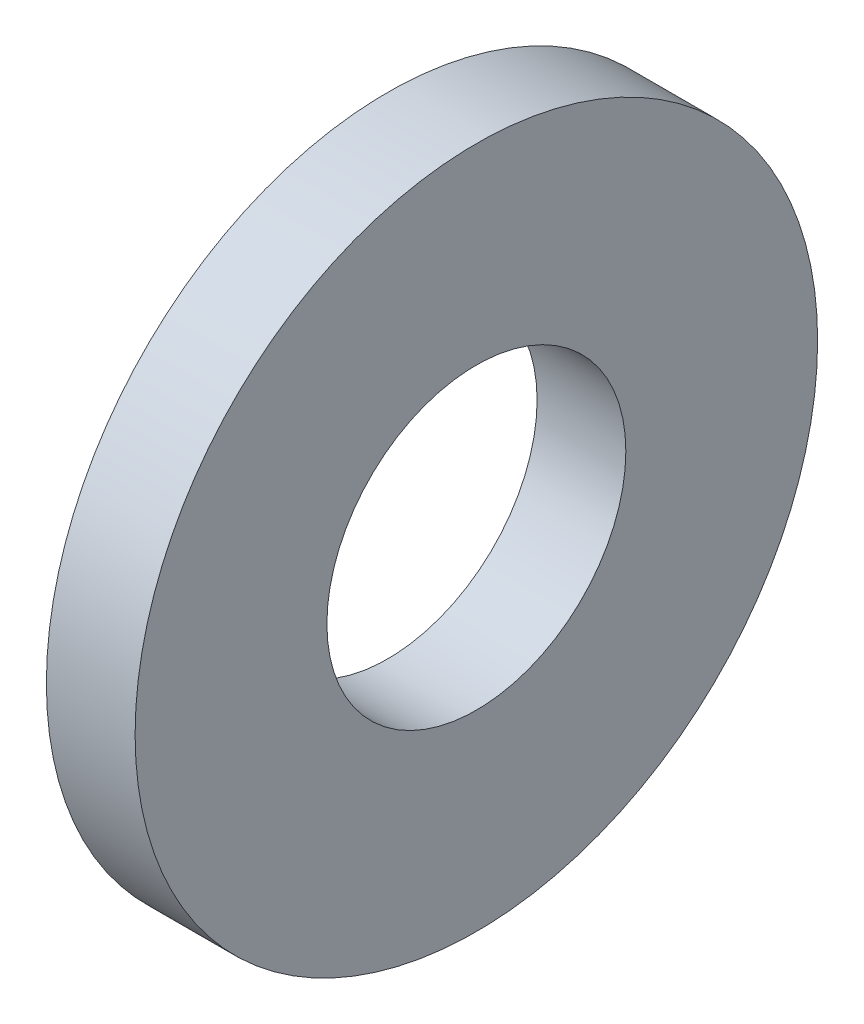
ISO-10303-21;
HEADER;
FILE_DESCRIPTION(('STEP AP214'),'2;1');
FILE_NAME('part.step','',(''),(''),'','','');
FILE_SCHEMA(('AUTOMOTIVE_DESIGN { 1 0 10303 214 1 1 1 1 }'));
ENDSEC;
DATA;
#1=APPLICATION_CONTEXT('core data for automotive mechanical design processes');
#2=APPLICATION_PROTOCOL_DEFINITION('international standard','automotive_design',2000,#1);
#3=PRODUCT_CONTEXT('',#1,'mechanical');
#4=PRODUCT('Part','Part','',(#3));
#5=PRODUCT_RELATED_PRODUCT_CATEGORY('part','',(#4));
#6=PRODUCT_DEFINITION_FORMATION('','',#4);
#7=PRODUCT_DEFINITION_CONTEXT('part definition',#1,'design');
#8=PRODUCT_DEFINITION('design','',#6,#7);
#9=PRODUCT_DEFINITION_SHAPE('','',#8);
#10=(LENGTH_UNIT() NAMED_UNIT(*) SI_UNIT(.MILLI.,.METRE.));
#11=(NAMED_UNIT(*) PLANE_ANGLE_UNIT() SI_UNIT($,.RADIAN.));
#12=(NAMED_UNIT(*) SI_UNIT($,.STERADIAN.) SOLID_ANGLE_UNIT());
#13=UNCERTAINTY_MEASURE_WITH_UNIT(LENGTH_MEASURE(1.E-05),#10,'distance_accuracy_value','');
#14=(GEOMETRIC_REPRESENTATION_CONTEXT(3) GLOBAL_UNCERTAINTY_ASSIGNED_CONTEXT((#13)) GLOBAL_UNIT_ASSIGNED_CONTEXT((#10,
#11,#12)) REPRESENTATION_CONTEXT('',''));
#15=CARTESIAN_POINT('',(0.,0.,0.));
#16=DIRECTION('',(0.,0.,1.));
#17=DIRECTION('',(1.,0.,0.));
#18=AXIS2_PLACEMENT_3D('',#15,#16,#17);
#19=CARTESIAN_POINT('',(1.651,0.,0.));
#20=DIRECTION('',(1.,0.,0.));
#21=DIRECTION('',(0.,0.,-1.));
#22=AXIS2_PLACEMENT_3D('',#19,#20,#21);
#23=PLANE('',#22);
#24=CARTESIAN_POINT('',(1.651,0.,0.));
#25=DIRECTION('',(1.,0.,0.));
#26=DIRECTION('',(0.,0.,-1.));
#27=AXIS2_PLACEMENT_3D('',#24,#25,#26);
#28=CIRCLE('',#27,6.35);
#29=CARTESIAN_POINT('',(1.651,0.,6.35));
#30=VERTEX_POINT('',#29);
#31=EDGE_CURVE('E10',#30,#30,#28,.T.);
#32=ORIENTED_EDGE('',*,*,#31,.T.);
#33=EDGE_LOOP('',(#32));
#34=FACE_BOUND('',#33,.T.);
#35=CARTESIAN_POINT('',(1.651,0.,0.));
#36=DIRECTION('',(1.,0.,0.));
#37=DIRECTION('',(0.,0.,-1.));
#38=AXIS2_PLACEMENT_3D('',#35,#36,#37);
#39=CIRCLE('',#38,2.7813);
#40=CARTESIAN_POINT('',(1.651,0.,2.7813));
#41=VERTEX_POINT('',#40);
#42=EDGE_CURVE('E41',#41,#41,#39,.T.);
#43=ORIENTED_EDGE('',*,*,#42,.F.);
#44=EDGE_LOOP('',(#43));
#45=FACE_BOUND('',#44,.T.);
#46=ADVANCED_FACE('F30',(#34,#45),#23,.T.);
#47=CARTESIAN_POINT('',(0.,0.,0.));
#48=DIRECTION('',(1.,0.,0.));
#49=DIRECTION('',(0.,0.,-1.));
#50=AXIS2_PLACEMENT_3D('',#47,#48,#49);
#51=PLANE('',#50);
#52=CARTESIAN_POINT('',(0.,0.,0.));
#53=DIRECTION('',(1.,0.,0.));
#54=DIRECTION('',(0.,0.,-1.));
#55=AXIS2_PLACEMENT_3D('',#52,#53,#54);
#56=CIRCLE('',#55,6.35);
#57=CARTESIAN_POINT('',(0.,0.,6.35));
#58=VERTEX_POINT('',#57);
#59=EDGE_CURVE('E34',#58,#58,#56,.T.);
#60=ORIENTED_EDGE('',*,*,#59,.F.);
#61=EDGE_LOOP('',(#60));
#62=FACE_BOUND('',#61,.T.);
#63=CARTESIAN_POINT('',(0.,0.,0.));
#64=DIRECTION('',(1.,0.,0.));
#65=DIRECTION('',(0.,0.,-1.));
#66=AXIS2_PLACEMENT_3D('',#63,#64,#65);
#67=CIRCLE('',#66,2.7813);
#68=CARTESIAN_POINT('',(0.,0.,2.7813));
#69=VERTEX_POINT('',#68);
#70=EDGE_CURVE('E43',#69,#69,#67,.T.);
#71=ORIENTED_EDGE('',*,*,#70,.T.);
#72=EDGE_LOOP('',(#71));
#73=FACE_BOUND('',#72,.T.);
#74=ADVANCED_FACE('F53',(#62,#73),#51,.F.);
#75=CARTESIAN_POINT('',(1.651,0.,0.));
#76=DIRECTION('',(-1.,0.,0.));
#77=DIRECTION('',(0.,0.,1.));
#78=AXIS2_PLACEMENT_3D('',#75,#76,#77);
#79=CYLINDRICAL_SURFACE('',#78,6.35);
#80=CARTESIAN_POINT('',(1.651,0.,6.35));
#81=CARTESIAN_POINT('',(1.63380208333333,0.,6.35));
#82=CARTESIAN_POINT('',(1.61660416666667,0.,6.35));
#83=CARTESIAN_POINT('',(1.58220833333333,0.,6.35));
#84=CARTESIAN_POINT('',(1.56501041666667,0.,6.35));
#85=CARTESIAN_POINT('',(1.53061458333333,0.,6.35));
#86=CARTESIAN_POINT('',(1.51341666666667,0.,6.35));
#87=CARTESIAN_POINT('',(1.47902083333333,0.,6.35));
#88=CARTESIAN_POINT('',(1.46182291666667,0.,6.35));
#89=CARTESIAN_POINT('',(1.42742708333333,0.,6.35));
#90=CARTESIAN_POINT('',(1.41022916666667,0.,6.35));
#91=CARTESIAN_POINT('',(1.37583333333333,0.,6.35));
#92=CARTESIAN_POINT('',(1.35863541666667,0.,6.35));
#93=CARTESIAN_POINT('',(1.32423958333333,0.,6.35));
#94=CARTESIAN_POINT('',(1.30704166666667,0.,6.35));
#95=CARTESIAN_POINT('',(1.27264583333333,0.,6.35));
#96=CARTESIAN_POINT('',(1.25544791666667,0.,6.35));
#97=CARTESIAN_POINT('',(1.22105208333333,0.,6.35));
#98=CARTESIAN_POINT('',(1.20385416666667,0.,6.35));
#99=CARTESIAN_POINT('',(1.16945833333333,0.,6.35));
#100=CARTESIAN_POINT('',(1.15226041666667,0.,6.35));
#101=CARTESIAN_POINT('',(1.11786458333333,0.,6.35));
#102=CARTESIAN_POINT('',(1.10066666666667,0.,6.35));
#103=CARTESIAN_POINT('',(1.06627083333333,0.,6.35));
#104=CARTESIAN_POINT('',(1.04907291666667,0.,6.35));
#105=CARTESIAN_POINT('',(1.01467708333333,0.,6.35));
#106=CARTESIAN_POINT('',(0.997479166666666,0.,6.35));
#107=CARTESIAN_POINT('',(0.963083333333333,0.,6.35));
#108=CARTESIAN_POINT('',(0.945885416666667,0.,6.35));
#109=CARTESIAN_POINT('',(0.911489583333333,0.,6.35));
#110=CARTESIAN_POINT('',(0.894291666666667,0.,6.35));
#111=CARTESIAN_POINT('',(0.859895833333333,0.,6.35));
#112=CARTESIAN_POINT('',(0.842697916666667,0.,6.35));
#113=CARTESIAN_POINT('',(0.808302083333333,0.,6.35));
#114=CARTESIAN_POINT('',(0.791104166666667,0.,6.35));
#115=CARTESIAN_POINT('',(0.756708333333333,0.,6.35));
#116=CARTESIAN_POINT('',(0.739510416666667,0.,6.35));
#117=CARTESIAN_POINT('',(0.705114583333333,0.,6.35));
#118=CARTESIAN_POINT('',(0.687916666666667,0.,6.35));
#119=CARTESIAN_POINT('',(0.653520833333333,0.,6.35));
#120=CARTESIAN_POINT('',(0.636322916666667,0.,6.35));
#121=CARTESIAN_POINT('',(0.601927083333333,0.,6.35));
#122=CARTESIAN_POINT('',(0.584729166666667,0.,6.35));
#123=CARTESIAN_POINT('',(0.550333333333333,0.,6.35));
#124=CARTESIAN_POINT('',(0.533135416666667,0.,6.35));
#125=CARTESIAN_POINT('',(0.498739583333333,0.,6.35));
#126=CARTESIAN_POINT('',(0.481541666666667,0.,6.35));
#127=CARTESIAN_POINT('',(0.447145833333333,0.,6.35));
#128=CARTESIAN_POINT('',(0.429947916666667,0.,6.35));
#129=CARTESIAN_POINT('',(0.395552083333333,0.,6.35));
#130=CARTESIAN_POINT('',(0.378354166666667,0.,6.35));
#131=CARTESIAN_POINT('',(0.343958333333333,0.,6.35));
#132=CARTESIAN_POINT('',(0.326760416666667,0.,6.35));
#133=CARTESIAN_POINT('',(0.292364583333333,0.,6.35));
#134=CARTESIAN_POINT('',(0.275166666666667,0.,6.35));
#135=CARTESIAN_POINT('',(0.240770833333333,0.,6.35));
#136=CARTESIAN_POINT('',(0.223572916666667,0.,6.35));
#137=CARTESIAN_POINT('',(0.189177083333333,0.,6.35));
#138=CARTESIAN_POINT('',(0.171979166666667,0.,6.35));
#139=CARTESIAN_POINT('',(0.137583333333333,0.,6.35));
#140=CARTESIAN_POINT('',(0.120385416666667,0.,6.35));
#141=CARTESIAN_POINT('',(0.0859895833333333,0.,6.35));
#142=CARTESIAN_POINT('',(0.0687916666666667,0.,6.35));
#143=CARTESIAN_POINT('',(0.0343958333333333,0.,6.35));
#144=CARTESIAN_POINT('',(0.0171979166666666,0.,6.35));
#145=CARTESIAN_POINT('',(0.,0.,6.35));
#146=B_SPLINE_CURVE_WITH_KNOTS('',3,(#80,#81,#82,#83,#84,#85,#86,#87,#88,#89,#90,#91,#92,#93,
#94,#95,#96,#97,#98,#99,#100,#101,#102,#103,#104,#105,#106,#107,#108,#109,#110,#111,#112,#113,
#114,#115,#116,#117,#118,#119,#120,#121,#122,#123,#124,#125,#126,#127,#128,#129,#130,#131,#132,
#133,#134,#135,#136,#137,#138,#139,#140,#141,#142,#143,#144,#145),.UNSPECIFIED.,.F.,.F.,(4,2,2,
2,2,2,2,2,2,2,2,2,2,2,2,2,2,2,2,2,2,2,2,2,2,2,2,2,2,2,2,2,4),(0.,0.05159375,0.1031875,
0.15478125,0.206375,0.25796875,0.3095625,0.36115625,0.41275,0.46434375,0.5159375,0.56753125,
0.619125,0.67071875,0.7223125,0.77390625,0.8255,0.87709375,0.9286875,0.98028125,1.031875,
1.08346875,1.1350625,1.18665625,1.23825,1.28984375,1.3414375,1.39303125,1.444625,1.49621875,
1.5478125,1.59940625,1.651),.UNSPECIFIED.);
#147=EDGE_CURVE('BSEAM32',#30,#58,#146,.T.);
#148=ORIENTED_EDGE('',*,*,#31,.F.);
#149=ORIENTED_EDGE('',*,*,#59,.T.);
#150=ORIENTED_EDGE('',*,*,#147,.T.);
#151=ORIENTED_EDGE('',*,*,#147,.F.);
#152=EDGE_LOOP('',(#148,#150,#149,#151));
#153=FACE_BOUND('',#152,.T.);
#154=ADVANCED_FACE('F32',(#153),#79,.T.);
#155=CARTESIAN_POINT('',(1.651,0.,0.));
#156=DIRECTION('',(-1.,0.,0.));
#157=DIRECTION('',(0.,0.,1.));
#158=AXIS2_PLACEMENT_3D('',#155,#156,#157);
#159=CYLINDRICAL_SURFACE('',#158,2.7813);
#160=CARTESIAN_POINT('',(1.651,0.,2.7813));
#161=CARTESIAN_POINT('',(1.63380208333333,0.,2.7813));
#162=CARTESIAN_POINT('',(1.61660416666667,0.,2.7813));
#163=CARTESIAN_POINT('',(1.58220833333333,0.,2.7813));
#164=CARTESIAN_POINT('',(1.56501041666667,0.,2.7813));
#165=CARTESIAN_POINT('',(1.53061458333333,0.,2.7813));
#166=CARTESIAN_POINT('',(1.51341666666667,0.,2.7813));
#167=CARTESIAN_POINT('',(1.47902083333333,0.,2.7813));
#168=CARTESIAN_POINT('',(1.46182291666667,0.,2.7813));
#169=CARTESIAN_POINT('',(1.42742708333333,0.,2.7813));
#170=CARTESIAN_POINT('',(1.41022916666667,0.,2.7813));
#171=CARTESIAN_POINT('',(1.37583333333333,0.,2.7813));
#172=CARTESIAN_POINT('',(1.35863541666667,0.,2.7813));
#173=CARTESIAN_POINT('',(1.32423958333333,0.,2.7813));
#174=CARTESIAN_POINT('',(1.30704166666667,0.,2.7813));
#175=CARTESIAN_POINT('',(1.27264583333333,0.,2.7813));
#176=CARTESIAN_POINT('',(1.25544791666667,0.,2.7813));
#177=CARTESIAN_POINT('',(1.22105208333333,0.,2.7813));
#178=CARTESIAN_POINT('',(1.20385416666667,0.,2.7813));
#179=CARTESIAN_POINT('',(1.16945833333333,0.,2.7813));
#180=CARTESIAN_POINT('',(1.15226041666667,0.,2.7813));
#181=CARTESIAN_POINT('',(1.11786458333333,0.,2.7813));
#182=CARTESIAN_POINT('',(1.10066666666667,0.,2.7813));
#183=CARTESIAN_POINT('',(1.06627083333333,0.,2.7813));
#184=CARTESIAN_POINT('',(1.04907291666667,0.,2.7813));
#185=CARTESIAN_POINT('',(1.01467708333333,0.,2.7813));
#186=CARTESIAN_POINT('',(0.997479166666666,0.,2.7813));
#187=CARTESIAN_POINT('',(0.963083333333333,0.,2.7813));
#188=CARTESIAN_POINT('',(0.945885416666667,0.,2.7813));
#189=CARTESIAN_POINT('',(0.911489583333333,0.,2.7813));
#190=CARTESIAN_POINT('',(0.894291666666667,0.,2.7813));
#191=CARTESIAN_POINT('',(0.859895833333333,0.,2.7813));
#192=CARTESIAN_POINT('',(0.842697916666667,0.,2.7813));
#193=CARTESIAN_POINT('',(0.808302083333333,0.,2.7813));
#194=CARTESIAN_POINT('',(0.791104166666667,0.,2.7813));
#195=CARTESIAN_POINT('',(0.756708333333333,0.,2.7813));
#196=CARTESIAN_POINT('',(0.739510416666667,0.,2.7813));
#197=CARTESIAN_POINT('',(0.705114583333333,0.,2.7813));
#198=CARTESIAN_POINT('',(0.687916666666667,0.,2.7813));
#199=CARTESIAN_POINT('',(0.653520833333333,0.,2.7813));
#200=CARTESIAN_POINT('',(0.636322916666667,0.,2.7813));
#201=CARTESIAN_POINT('',(0.601927083333333,0.,2.7813));
#202=CARTESIAN_POINT('',(0.584729166666667,0.,2.7813));
#203=CARTESIAN_POINT('',(0.550333333333333,0.,2.7813));
#204=CARTESIAN_POINT('',(0.533135416666667,0.,2.7813));
#205=CARTESIAN_POINT('',(0.498739583333333,0.,2.7813));
#206=CARTESIAN_POINT('',(0.481541666666667,0.,2.7813));
#207=CARTESIAN_POINT('',(0.447145833333333,0.,2.7813));
#208=CARTESIAN_POINT('',(0.429947916666667,0.,2.7813));
#209=CARTESIAN_POINT('',(0.395552083333333,0.,2.7813));
#210=CARTESIAN_POINT('',(0.378354166666667,0.,2.7813));
#211=CARTESIAN_POINT('',(0.343958333333333,0.,2.7813));
#212=CARTESIAN_POINT('',(0.326760416666667,0.,2.7813));
#213=CARTESIAN_POINT('',(0.292364583333333,0.,2.7813));
#214=CARTESIAN_POINT('',(0.275166666666667,0.,2.7813));
#215=CARTESIAN_POINT('',(0.240770833333333,0.,2.7813));
#216=CARTESIAN_POINT('',(0.223572916666667,0.,2.7813));
#217=CARTESIAN_POINT('',(0.189177083333333,0.,2.7813));
#218=CARTESIAN_POINT('',(0.171979166666667,0.,2.7813));
#219=CARTESIAN_POINT('',(0.137583333333333,0.,2.7813));
#220=CARTESIAN_POINT('',(0.120385416666667,0.,2.7813));
#221=CARTESIAN_POINT('',(0.0859895833333333,0.,2.7813));
#222=CARTESIAN_POINT('',(0.0687916666666667,0.,2.7813));
#223=CARTESIAN_POINT('',(0.0343958333333333,0.,2.7813));
#224=CARTESIAN_POINT('',(0.0171979166666666,0.,2.7813));
#225=CARTESIAN_POINT('',(0.,0.,2.7813));
#226=B_SPLINE_CURVE_WITH_KNOTS('',3,(#160,#161,#162,#163,#164,#165,#166,#167,#168,#169,#170,
#171,#172,#173,#174,#175,#176,#177,#178,#179,#180,#181,#182,#183,#184,#185,#186,#187,#188,#189,
#190,#191,#192,#193,#194,#195,#196,#197,#198,#199,#200,#201,#202,#203,#204,#205,#206,#207,#208,
#209,#210,#211,#212,#213,#214,#215,#216,#217,#218,#219,#220,#221,#222,#223,#224,#225),
.UNSPECIFIED.,.F.,.F.,(4,2,2,2,2,2,2,2,2,2,2,2,2,2,2,2,2,2,2,2,2,2,2,2,2,2,2,2,2,2,2,2,4),(0.,
0.05159375,0.1031875,0.15478125,0.206375,0.25796875,0.3095625,0.36115625,0.41275,0.46434375,
0.5159375,0.56753125,0.619125,0.67071875,0.7223125,0.77390625,0.8255,0.87709375,0.9286875,
0.98028125,1.031875,1.08346875,1.1350625,1.18665625,1.23825,1.28984375,1.3414375,1.39303125,
1.444625,1.49621875,1.5478125,1.59940625,1.651),.UNSPECIFIED.);
#227=EDGE_CURVE('BSEAM49',#41,#69,#226,.T.);
#228=ORIENTED_EDGE('',*,*,#42,.T.);
#229=ORIENTED_EDGE('',*,*,#70,.F.);
#230=ORIENTED_EDGE('',*,*,#227,.T.);
#231=ORIENTED_EDGE('',*,*,#227,.F.);
#232=EDGE_LOOP('',(#228,#230,#229,#231));
#233=FACE_BOUND('',#232,.T.);
#234=ADVANCED_FACE('F49',(#233),#159,.F.);
#235=CLOSED_SHELL('',(#46,#74,#154,#234));
#236=MANIFOLD_SOLID_BREP('B2',#235);
#237=ADVANCED_BREP_SHAPE_REPRESENTATION('',(#18,#236),#14);
#238=SHAPE_DEFINITION_REPRESENTATION(#9,#237);
ENDSEC;
END-ISO-10303-21;
